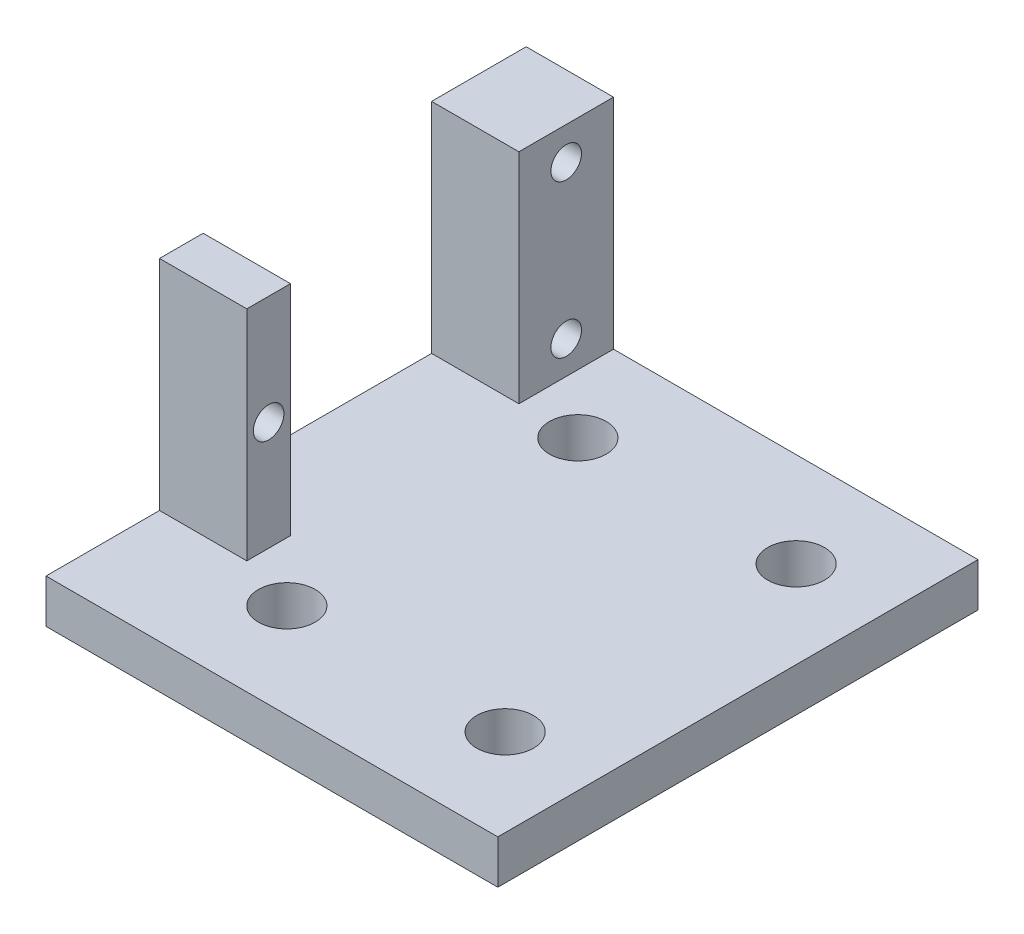
ISO-10303-21;
HEADER;
FILE_DESCRIPTION(('STEP AP214'),'2;1');
FILE_NAME('part.step','',(''),(''),'','','');
FILE_SCHEMA(('AUTOMOTIVE_DESIGN { 1 0 10303 214 1 1 1 1 }'));
ENDSEC;
DATA;
#1=APPLICATION_CONTEXT('core data for automotive mechanical design processes');
#2=APPLICATION_PROTOCOL_DEFINITION('international standard','automotive_design',2000,#1);
#3=PRODUCT_CONTEXT('',#1,'mechanical');
#4=PRODUCT('Part','Part','',(#3));
#5=PRODUCT_RELATED_PRODUCT_CATEGORY('part','',(#4));
#6=PRODUCT_DEFINITION_FORMATION('','',#4);
#7=PRODUCT_DEFINITION_CONTEXT('part definition',#1,'design');
#8=PRODUCT_DEFINITION('design','',#6,#7);
#9=PRODUCT_DEFINITION_SHAPE('','',#8);
#10=(LENGTH_UNIT() NAMED_UNIT(*) SI_UNIT(.MILLI.,.METRE.));
#11=(NAMED_UNIT(*) PLANE_ANGLE_UNIT() SI_UNIT($,.RADIAN.));
#12=(NAMED_UNIT(*) SI_UNIT($,.STERADIAN.) SOLID_ANGLE_UNIT());
#13=UNCERTAINTY_MEASURE_WITH_UNIT(LENGTH_MEASURE(1.E-05),#10,'distance_accuracy_value','');
#14=(GEOMETRIC_REPRESENTATION_CONTEXT(3) GLOBAL_UNCERTAINTY_ASSIGNED_CONTEXT((#13)) GLOBAL_UNIT_ASSIGNED_CONTEXT((#10,
#11,#12)) REPRESENTATION_CONTEXT('',''));
#15=CARTESIAN_POINT('',(0.,0.,0.));
#16=DIRECTION('',(0.,0.,1.));
#17=DIRECTION('',(1.,0.,0.));
#18=AXIS2_PLACEMENT_3D('',#15,#16,#17);
#19=CARTESIAN_POINT('',(0.,5.,0.));
#20=DIRECTION('',(0.,1.,0.));
#21=DIRECTION('',(0.,0.,1.));
#22=AXIS2_PLACEMENT_3D('',#19,#20,#21);
#23=PLANE('',#22);
#24=CARTESIAN_POINT('',(18.25,5.,16.665));
#25=DIRECTION('',(0.,1.,0.));
#26=DIRECTION('',(0.,0.,1.));
#27=AXIS2_PLACEMENT_3D('',#24,#25,#26);
#28=CIRCLE('',#27,3.25);
#29=CARTESIAN_POINT('',(18.25,5.,19.915));
#30=VERTEX_POINT('',#29);
#31=EDGE_CURVE('E200',#30,#30,#28,.T.);
#32=ORIENTED_EDGE('',*,*,#31,.F.);
#33=EDGE_LOOP('',(#32));
#34=FACE_BOUND('',#33,.T.);
#35=CARTESIAN_POINT('',(18.25,5.,-16.665));
#36=DIRECTION('',(0.,1.,0.));
#37=DIRECTION('',(0.,0.,1.));
#38=AXIS2_PLACEMENT_3D('',#35,#36,#37);
#39=CIRCLE('',#38,3.25);
#40=CARTESIAN_POINT('',(18.25,5.,-13.415));
#41=VERTEX_POINT('',#40);
#42=EDGE_CURVE('E204',#41,#41,#39,.T.);
#43=ORIENTED_EDGE('',*,*,#42,.F.);
#44=EDGE_LOOP('',(#43));
#45=FACE_BOUND('',#44,.T.);
#46=CARTESIAN_POINT('',(-6.75,5.,16.665));
#47=DIRECTION('',(0.,1.,0.));
#48=DIRECTION('',(0.,0.,1.));
#49=AXIS2_PLACEMENT_3D('',#46,#47,#48);
#50=CIRCLE('',#49,3.25);
#51=CARTESIAN_POINT('',(-6.75,5.,19.915));
#52=VERTEX_POINT('',#51);
#53=EDGE_CURVE('E209',#52,#52,#50,.T.);
#54=ORIENTED_EDGE('',*,*,#53,.F.);
#55=EDGE_LOOP('',(#54));
#56=FACE_BOUND('',#55,.T.);
#57=CARTESIAN_POINT('',(-6.75,5.,-16.665));
#58=DIRECTION('',(0.,1.,0.));
#59=DIRECTION('',(0.,0.,1.));
#60=AXIS2_PLACEMENT_3D('',#57,#58,#59);
#61=CIRCLE('',#60,3.25);
#62=CARTESIAN_POINT('',(-6.75,5.,-13.415));
#63=VERTEX_POINT('',#62);
#64=EDGE_CURVE('E213',#63,#63,#61,.T.);
#65=ORIENTED_EDGE('',*,*,#64,.F.);
#66=EDGE_LOOP('',(#65));
#67=FACE_BOUND('',#66,.T.);
#68=DIRECTION('',(0.,0.,-1.));
#69=VECTOR('',#68,1.);
#70=CARTESIAN_POINT('',(-13.5,5.,0.));
#71=LINE('',#70,#69);
#72=CARTESIAN_POINT('',(-13.5,5.,14.5));
#73=VERTEX_POINT('',#72);
#74=CARTESIAN_POINT('',(-13.5,5.,9.5));
#75=VERTEX_POINT('',#74);
#76=EDGE_CURVE('E60',#73,#75,#71,.T.);
#77=ORIENTED_EDGE('',*,*,#76,.F.);
#78=DIRECTION('',(-1.,0.,0.));
#79=VECTOR('',#78,1.);
#80=CARTESIAN_POINT('',(0.,5.,14.5));
#81=LINE('',#80,#79);
#82=CARTESIAN_POINT('',(-23.5,5.,14.5));
#83=VERTEX_POINT('',#82);
#84=EDGE_CURVE('E163',#73,#83,#81,.T.);
#85=ORIENTED_EDGE('',*,*,#84,.T.);
#86=DIRECTION('',(0.,0.,1.));
#87=VECTOR('',#86,1.);
#88=CARTESIAN_POINT('',(-23.5,5.,0.));
#89=LINE('',#88,#87);
#90=CARTESIAN_POINT('',(-23.5,5.,27.5));
#91=VERTEX_POINT('',#90);
#92=EDGE_CURVE('E151',#83,#91,#89,.T.);
#93=ORIENTED_EDGE('',*,*,#92,.T.);
#94=DIRECTION('',(1.,0.,0.));
#95=VECTOR('',#94,1.);
#96=CARTESIAN_POINT('',(0.,5.,27.5));
#97=LINE('',#96,#95);
#98=CARTESIAN_POINT('',(28.25,5.,27.5));
#99=VERTEX_POINT('',#98);
#100=EDGE_CURVE('E223',#91,#99,#97,.T.);
#101=ORIENTED_EDGE('',*,*,#100,.T.);
#102=DIRECTION('',(0.,0.,1.));
#103=VECTOR('',#102,1.);
#104=CARTESIAN_POINT('',(28.25,5.,0.));
#105=LINE('',#104,#103);
#106=CARTESIAN_POINT('',(28.25,5.,-27.5));
#107=VERTEX_POINT('',#106);
#108=EDGE_CURVE('E226',#107,#99,#105,.T.);
#109=ORIENTED_EDGE('',*,*,#108,.F.);
#110=DIRECTION('',(1.,0.,0.));
#111=VECTOR('',#110,1.);
#112=CARTESIAN_POINT('',(0.,5.,-27.5));
#113=LINE('',#112,#111);
#114=CARTESIAN_POINT('',(-13.5,5.,-27.5));
#115=VERTEX_POINT('',#114);
#116=EDGE_CURVE('E217',#115,#107,#113,.T.);
#117=ORIENTED_EDGE('',*,*,#116,.F.);
#118=DIRECTION('',(0.,0.,-1.));
#119=VECTOR('',#118,1.);
#120=CARTESIAN_POINT('',(-13.5,5.,0.));
#121=LINE('',#120,#119);
#122=CARTESIAN_POINT('',(-13.5,5.,-16.665));
#123=VERTEX_POINT('',#122);
#124=EDGE_CURVE('E191',#123,#115,#121,.T.);
#125=ORIENTED_EDGE('',*,*,#124,.F.);
#126=DIRECTION('',(-1.,0.,0.));
#127=VECTOR('',#126,1.);
#128=CARTESIAN_POINT('',(0.,5.,-16.665));
#129=LINE('',#128,#127);
#130=CARTESIAN_POINT('',(-23.5,5.,-16.665));
#131=VERTEX_POINT('',#130);
#132=EDGE_CURVE('E195',#123,#131,#129,.T.);
#133=ORIENTED_EDGE('',*,*,#132,.T.);
#134=CARTESIAN_POINT('',(-23.5,5.,9.5));
#135=VERTEX_POINT('',#134);
#136=EDGE_CURVE('E220',#131,#135,#89,.T.);
#137=ORIENTED_EDGE('',*,*,#136,.T.);
#138=DIRECTION('',(-1.,0.,0.));
#139=VECTOR('',#138,1.);
#140=CARTESIAN_POINT('',(0.,5.,9.5));
#141=LINE('',#140,#139);
#142=EDGE_CURVE('E65',#75,#135,#141,.T.);
#143=ORIENTED_EDGE('',*,*,#142,.F.);
#144=EDGE_LOOP('',(#77,#85,#93,#101,#109,#117,#125,#133,#137,#143));
#145=FACE_BOUND('',#144,.T.);
#146=ADVANCED_FACE('F42',(#34,#45,#56,#67,#145),#23,.T.);
#147=CARTESIAN_POINT('',(0.,5.,-27.5));
#148=DIRECTION('',(0.,0.,-1.));
#149=DIRECTION('',(-1.,0.,0.));
#150=AXIS2_PLACEMENT_3D('',#147,#148,#149);
#151=PLANE('',#150);
#152=DIRECTION('',(0.,-1.,0.));
#153=VECTOR('',#152,1.);
#154=CARTESIAN_POINT('',(28.25,5.,-27.5));
#155=LINE('',#154,#153);
#156=CARTESIAN_POINT('',(28.25,0.,-27.5));
#157=VERTEX_POINT('',#156);
#158=EDGE_CURVE('E230',#107,#157,#155,.T.);
#159=ORIENTED_EDGE('',*,*,#158,.T.);
#160=DIRECTION('',(1.,0.,0.));
#161=VECTOR('',#160,1.);
#162=CARTESIAN_POINT('',(0.,0.,-27.5));
#163=LINE('',#162,#161);
#164=CARTESIAN_POINT('',(-23.5,0.,-27.5));
#165=VERTEX_POINT('',#164);
#166=EDGE_CURVE('E246',#165,#157,#163,.T.);
#167=ORIENTED_EDGE('',*,*,#166,.F.);
#168=DIRECTION('',(0.,-1.,0.));
#169=VECTOR('',#168,1.);
#170=CARTESIAN_POINT('',(-23.5,5.,-27.5));
#171=LINE('',#170,#169);
#172=CARTESIAN_POINT('',(-23.5,30.,-27.5));
#173=VERTEX_POINT('',#172);
#174=EDGE_CURVE('E11',#173,#165,#171,.T.);
#175=ORIENTED_EDGE('',*,*,#174,.F.);
#176=DIRECTION('',(1.,0.,0.));
#177=VECTOR('',#176,1.);
#178=CARTESIAN_POINT('',(0.,30.,-27.5));
#179=LINE('',#178,#177);
#180=CARTESIAN_POINT('',(-13.5,30.,-27.5));
#181=VERTEX_POINT('',#180);
#182=EDGE_CURVE('E177',#173,#181,#179,.T.);
#183=ORIENTED_EDGE('',*,*,#182,.T.);
#184=DIRECTION('',(0.,-1.,0.));
#185=VECTOR('',#184,1.);
#186=CARTESIAN_POINT('',(-13.5,30.,-27.5));
#187=LINE('',#186,#185);
#188=EDGE_CURVE('E181',#181,#115,#187,.T.);
#189=ORIENTED_EDGE('',*,*,#188,.T.);
#190=ORIENTED_EDGE('',*,*,#116,.T.);
#191=EDGE_LOOP('',(#159,#167,#175,#183,#189,#190));
#192=FACE_BOUND('',#191,.T.);
#193=ADVANCED_FACE('F313',(#192),#151,.T.);
#194=CARTESIAN_POINT('',(-23.5,5.,0.));
#195=DIRECTION('',(1.,0.,0.));
#196=DIRECTION('',(0.,0.,-1.));
#197=AXIS2_PLACEMENT_3D('',#194,#195,#196);
#198=PLANE('',#197);
#199=CARTESIAN_POINT('',(-23.5,17.5,12.));
#200=DIRECTION('',(1.,0.,0.));
#201=DIRECTION('',(0.,0.,-1.));
#202=AXIS2_PLACEMENT_3D('',#199,#200,#201);
#203=CIRCLE('',#202,1.75);
#204=CARTESIAN_POINT('',(-23.5,17.5,10.25));
#205=VERTEX_POINT('',#204);
#206=EDGE_CURVE('E283',#205,#205,#203,.T.);
#207=ORIENTED_EDGE('',*,*,#206,.T.);
#208=EDGE_LOOP('',(#207));
#209=FACE_BOUND('',#208,.T.);
#210=CARTESIAN_POINT('',(-23.5,26.25,-22.0825));
#211=DIRECTION('',(1.,0.,0.));
#212=DIRECTION('',(0.,0.,-1.));
#213=AXIS2_PLACEMENT_3D('',#210,#211,#212);
#214=CIRCLE('',#213,1.75);
#215=CARTESIAN_POINT('',(-23.5,26.25,-23.8325));
#216=VERTEX_POINT('',#215);
#217=EDGE_CURVE('E270',#216,#216,#214,.T.);
#218=ORIENTED_EDGE('',*,*,#217,.T.);
#219=EDGE_LOOP('',(#218));
#220=FACE_BOUND('',#219,.T.);
#221=CARTESIAN_POINT('',(-23.5,8.75,-22.0825));
#222=DIRECTION('',(1.,0.,0.));
#223=DIRECTION('',(0.,0.,-1.));
#224=AXIS2_PLACEMENT_3D('',#221,#222,#223);
#225=CIRCLE('',#224,1.75);
#226=CARTESIAN_POINT('',(-23.5,8.75,-23.8325));
#227=VERTEX_POINT('',#226);
#228=EDGE_CURVE('E277',#227,#227,#225,.T.);
#229=ORIENTED_EDGE('',*,*,#228,.T.);
#230=EDGE_LOOP('',(#229));
#231=FACE_BOUND('',#230,.T.);
#232=DIRECTION('',(0.,0.,1.));
#233=VECTOR('',#232,1.);
#234=CARTESIAN_POINT('',(-23.5,0.,0.));
#235=LINE('',#234,#233);
#236=CARTESIAN_POINT('',(-23.5,0.,27.5));
#237=VERTEX_POINT('',#236);
#238=EDGE_CURVE('E249',#165,#237,#235,.T.);
#239=ORIENTED_EDGE('',*,*,#238,.T.);
#240=DIRECTION('',(0.,-1.,0.));
#241=VECTOR('',#240,1.);
#242=CARTESIAN_POINT('',(-23.5,5.,27.5));
#243=LINE('',#242,#241);
#244=EDGE_CURVE('E52',#91,#237,#243,.T.);
#245=ORIENTED_EDGE('',*,*,#244,.F.);
#246=ORIENTED_EDGE('',*,*,#92,.F.);
#247=DIRECTION('',(0.,-1.,0.));
#248=VECTOR('',#247,1.);
#249=CARTESIAN_POINT('',(-23.5,30.,14.5));
#250=LINE('',#249,#248);
#251=CARTESIAN_POINT('',(-23.5,30.,14.5));
#252=VERTEX_POINT('',#251);
#253=EDGE_CURVE('E129',#252,#83,#250,.T.);
#254=ORIENTED_EDGE('',*,*,#253,.F.);
#255=DIRECTION('',(0.,0.,1.));
#256=VECTOR('',#255,1.);
#257=CARTESIAN_POINT('',(-23.5,30.,0.));
#258=LINE('',#257,#256);
#259=CARTESIAN_POINT('',(-23.5,30.,9.5));
#260=VERTEX_POINT('',#259);
#261=EDGE_CURVE('E137',#260,#252,#258,.T.);
#262=ORIENTED_EDGE('',*,*,#261,.F.);
#263=DIRECTION('',(0.,-1.,0.));
#264=VECTOR('',#263,1.);
#265=CARTESIAN_POINT('',(-23.5,30.,9.5));
#266=LINE('',#265,#264);
#267=EDGE_CURVE('E293',#260,#135,#266,.T.);
#268=ORIENTED_EDGE('',*,*,#267,.T.);
#269=ORIENTED_EDGE('',*,*,#136,.F.);
#270=DIRECTION('',(0.,-1.,0.));
#271=VECTOR('',#270,1.);
#272=CARTESIAN_POINT('',(-23.5,30.,-16.665));
#273=LINE('',#272,#271);
#274=CARTESIAN_POINT('',(-23.5,30.,-16.665));
#275=VERTEX_POINT('',#274);
#276=EDGE_CURVE('E188',#275,#131,#273,.T.);
#277=ORIENTED_EDGE('',*,*,#276,.F.);
#278=DIRECTION('',(0.,0.,1.));
#279=VECTOR('',#278,1.);
#280=CARTESIAN_POINT('',(-23.5,30.,0.));
#281=LINE('',#280,#279);
#282=EDGE_CURVE('E166',#173,#275,#281,.T.);
#283=ORIENTED_EDGE('',*,*,#282,.F.);
#284=ORIENTED_EDGE('',*,*,#174,.T.);
#285=EDGE_LOOP('',(#239,#245,#246,#254,#262,#268,#269,#277,#283,#284));
#286=FACE_BOUND('',#285,.T.);
#287=ADVANCED_FACE('F149',(#209,#220,#231,#286),#198,.F.);
#288=CARTESIAN_POINT('',(0.,5.,27.5));
#289=DIRECTION('',(0.,0.,-1.));
#290=DIRECTION('',(-1.,0.,0.));
#291=AXIS2_PLACEMENT_3D('',#288,#289,#290);
#292=PLANE('',#291);
#293=DIRECTION('',(1.,0.,0.));
#294=VECTOR('',#293,1.);
#295=CARTESIAN_POINT('',(0.,0.,27.5));
#296=LINE('',#295,#294);
#297=CARTESIAN_POINT('',(28.25,0.,27.5));
#298=VERTEX_POINT('',#297);
#299=EDGE_CURVE('E252',#237,#298,#296,.T.);
#300=ORIENTED_EDGE('',*,*,#299,.T.);
#301=DIRECTION('',(0.,-1.,0.));
#302=VECTOR('',#301,1.);
#303=CARTESIAN_POINT('',(28.25,5.,27.5));
#304=LINE('',#303,#302);
#305=EDGE_CURVE('E262',#99,#298,#304,.T.);
#306=ORIENTED_EDGE('',*,*,#305,.F.);
#307=ORIENTED_EDGE('',*,*,#100,.F.);
#308=ORIENTED_EDGE('',*,*,#244,.T.);
#309=EDGE_LOOP('',(#300,#306,#307,#308));
#310=FACE_BOUND('',#309,.T.);
#311=ADVANCED_FACE('F335',(#310),#292,.F.);
#312=CARTESIAN_POINT('',(-6.75,5.,-16.665));
#313=DIRECTION('',(0.,-1.,0.));
#314=DIRECTION('',(0.,0.,-1.));
#315=AXIS2_PLACEMENT_3D('',#312,#313,#314);
#316=CYLINDRICAL_SURFACE('',#315,3.25);
#317=ORIENTED_EDGE('',*,*,#64,.T.);
#318=EDGE_LOOP('',(#317));
#319=FACE_BOUND('',#318,.T.);
#320=CARTESIAN_POINT('',(-6.75,0.,-16.665));
#321=DIRECTION('',(0.,1.,0.));
#322=DIRECTION('',(0.,0.,1.));
#323=AXIS2_PLACEMENT_3D('',#320,#321,#322);
#324=CIRCLE('',#323,3.25);
#325=CARTESIAN_POINT('',(-6.75,0.,-13.415));
#326=VERTEX_POINT('',#325);
#327=EDGE_CURVE('E242',#326,#326,#324,.T.);
#328=ORIENTED_EDGE('',*,*,#327,.F.);
#329=EDGE_LOOP('',(#328));
#330=FACE_BOUND('',#329,.T.);
#331=ADVANCED_FACE('F338',(#319,#330),#316,.F.);
#332=CARTESIAN_POINT('',(-6.75,5.,16.665));
#333=DIRECTION('',(0.,-1.,0.));
#334=DIRECTION('',(0.,0.,-1.));
#335=AXIS2_PLACEMENT_3D('',#332,#333,#334);
#336=CYLINDRICAL_SURFACE('',#335,3.25);
#337=ORIENTED_EDGE('',*,*,#53,.T.);
#338=EDGE_LOOP('',(#337));
#339=FACE_BOUND('',#338,.T.);
#340=CARTESIAN_POINT('',(-6.75,0.,16.665));
#341=DIRECTION('',(0.,1.,0.));
#342=DIRECTION('',(0.,0.,1.));
#343=AXIS2_PLACEMENT_3D('',#340,#341,#342);
#344=CIRCLE('',#343,3.25);
#345=CARTESIAN_POINT('',(-6.75,0.,19.915));
#346=VERTEX_POINT('',#345);
#347=EDGE_CURVE('E238',#346,#346,#344,.T.);
#348=ORIENTED_EDGE('',*,*,#347,.F.);
#349=EDGE_LOOP('',(#348));
#350=FACE_BOUND('',#349,.T.);
#351=ADVANCED_FACE('F345',(#339,#350),#336,.F.);
#352=CARTESIAN_POINT('',(18.25,5.,-16.665));
#353=DIRECTION('',(0.,-1.,0.));
#354=DIRECTION('',(0.,0.,-1.));
#355=AXIS2_PLACEMENT_3D('',#352,#353,#354);
#356=CYLINDRICAL_SURFACE('',#355,3.25);
#357=ORIENTED_EDGE('',*,*,#42,.T.);
#358=EDGE_LOOP('',(#357));
#359=FACE_BOUND('',#358,.T.);
#360=CARTESIAN_POINT('',(18.25,0.,-16.665));
#361=DIRECTION('',(0.,1.,0.));
#362=DIRECTION('',(0.,0.,1.));
#363=AXIS2_PLACEMENT_3D('',#360,#361,#362);
#364=CIRCLE('',#363,3.25);
#365=CARTESIAN_POINT('',(18.25,0.,-13.415));
#366=VERTEX_POINT('',#365);
#367=EDGE_CURVE('E234',#366,#366,#364,.T.);
#368=ORIENTED_EDGE('',*,*,#367,.F.);
#369=EDGE_LOOP('',(#368));
#370=FACE_BOUND('',#369,.T.);
#371=ADVANCED_FACE('F348',(#359,#370),#356,.F.);
#372=CARTESIAN_POINT('',(18.25,5.,16.665));
#373=DIRECTION('',(0.,-1.,0.));
#374=DIRECTION('',(0.,0.,-1.));
#375=AXIS2_PLACEMENT_3D('',#372,#373,#374);
#376=CYLINDRICAL_SURFACE('',#375,3.25);
#377=ORIENTED_EDGE('',*,*,#31,.T.);
#378=EDGE_LOOP('',(#377));
#379=FACE_BOUND('',#378,.T.);
#380=CARTESIAN_POINT('',(18.25,0.,16.665));
#381=DIRECTION('',(0.,1.,0.));
#382=DIRECTION('',(0.,0.,1.));
#383=AXIS2_PLACEMENT_3D('',#380,#381,#382);
#384=CIRCLE('',#383,3.25);
#385=CARTESIAN_POINT('',(18.25,0.,19.915));
#386=VERTEX_POINT('',#385);
#387=EDGE_CURVE('E199',#386,#386,#384,.T.);
#388=ORIENTED_EDGE('',*,*,#387,.F.);
#389=EDGE_LOOP('',(#388));
#390=FACE_BOUND('',#389,.T.);
#391=ADVANCED_FACE('F44',(#379,#390),#376,.F.);
#392=CARTESIAN_POINT('',(28.25,5.,0.));
#393=DIRECTION('',(1.,0.,0.));
#394=DIRECTION('',(0.,0.,-1.));
#395=AXIS2_PLACEMENT_3D('',#392,#393,#394);
#396=PLANE('',#395);
#397=DIRECTION('',(0.,0.,1.));
#398=VECTOR('',#397,1.);
#399=CARTESIAN_POINT('',(28.25,0.,0.));
#400=LINE('',#399,#398);
#401=EDGE_CURVE('E205',#157,#298,#400,.T.);
#402=ORIENTED_EDGE('',*,*,#401,.F.);
#403=ORIENTED_EDGE('',*,*,#158,.F.);
#404=ORIENTED_EDGE('',*,*,#108,.T.);
#405=ORIENTED_EDGE('',*,*,#305,.T.);
#406=EDGE_LOOP('',(#402,#403,#404,#405));
#407=FACE_BOUND('',#406,.T.);
#408=ADVANCED_FACE('F330',(#407),#396,.T.);
#409=CARTESIAN_POINT('',(0.,0.,0.));
#410=DIRECTION('',(0.,1.,0.));
#411=DIRECTION('',(0.,0.,1.));
#412=AXIS2_PLACEMENT_3D('',#409,#410,#411);
#413=PLANE('',#412);
#414=ORIENTED_EDGE('',*,*,#299,.F.);
#415=ORIENTED_EDGE('',*,*,#238,.F.);
#416=ORIENTED_EDGE('',*,*,#166,.T.);
#417=ORIENTED_EDGE('',*,*,#401,.T.);
#418=EDGE_LOOP('',(#414,#415,#416,#417));
#419=FACE_BOUND('',#418,.T.);
#420=ORIENTED_EDGE('',*,*,#387,.T.);
#421=EDGE_LOOP('',(#420));
#422=FACE_BOUND('',#421,.T.);
#423=ORIENTED_EDGE('',*,*,#367,.T.);
#424=EDGE_LOOP('',(#423));
#425=FACE_BOUND('',#424,.T.);
#426=ORIENTED_EDGE('',*,*,#347,.T.);
#427=EDGE_LOOP('',(#426));
#428=FACE_BOUND('',#427,.T.);
#429=ORIENTED_EDGE('',*,*,#327,.T.);
#430=EDGE_LOOP('',(#429));
#431=FACE_BOUND('',#430,.T.);
#432=ADVANCED_FACE('F327',(#419,#422,#425,#428,#431),#413,.F.);
#433=CARTESIAN_POINT('',(0.,30.,-16.665));
#434=DIRECTION('',(0.,0.,-1.));
#435=DIRECTION('',(-1.,0.,0.));
#436=AXIS2_PLACEMENT_3D('',#433,#434,#435);
#437=PLANE('',#436);
#438=ORIENTED_EDGE('',*,*,#132,.F.);
#439=DIRECTION('',(0.,-1.,0.));
#440=VECTOR('',#439,1.);
#441=CARTESIAN_POINT('',(-13.5,30.,-16.665));
#442=LINE('',#441,#440);
#443=CARTESIAN_POINT('',(-13.5,30.,-16.665));
#444=VERTEX_POINT('',#443);
#445=EDGE_CURVE('E184',#444,#123,#442,.T.);
#446=ORIENTED_EDGE('',*,*,#445,.F.);
#447=DIRECTION('',(1.,0.,0.));
#448=VECTOR('',#447,1.);
#449=CARTESIAN_POINT('',(0.,30.,-16.665));
#450=LINE('',#449,#448);
#451=EDGE_CURVE('E170',#275,#444,#450,.T.);
#452=ORIENTED_EDGE('',*,*,#451,.F.);
#453=ORIENTED_EDGE('',*,*,#276,.T.);
#454=EDGE_LOOP('',(#438,#446,#452,#453));
#455=FACE_BOUND('',#454,.T.);
#456=ADVANCED_FACE('F325',(#455),#437,.F.);
#457=CARTESIAN_POINT('',(-13.5,30.,0.));
#458=DIRECTION('',(1.,0.,0.));
#459=DIRECTION('',(0.,0.,-1.));
#460=AXIS2_PLACEMENT_3D('',#457,#458,#459);
#461=PLANE('',#460);
#462=CARTESIAN_POINT('',(-13.5,26.25,-22.0825));
#463=DIRECTION('',(1.,0.,0.));
#464=DIRECTION('',(0.,0.,-1.));
#465=AXIS2_PLACEMENT_3D('',#462,#463,#464);
#466=CIRCLE('',#465,1.75);
#467=CARTESIAN_POINT('',(-13.5,26.25,-23.8325));
#468=VERTEX_POINT('',#467);
#469=EDGE_CURVE('E46',#468,#468,#466,.T.);
#470=ORIENTED_EDGE('',*,*,#469,.F.);
#471=EDGE_LOOP('',(#470));
#472=FACE_BOUND('',#471,.T.);
#473=CARTESIAN_POINT('',(-13.5,8.75,-22.0825));
#474=DIRECTION('',(1.,0.,0.));
#475=DIRECTION('',(0.,0.,-1.));
#476=AXIS2_PLACEMENT_3D('',#473,#474,#475);
#477=CIRCLE('',#476,1.75);
#478=CARTESIAN_POINT('',(-13.5,8.75,-23.8325));
#479=VERTEX_POINT('',#478);
#480=EDGE_CURVE('E267',#479,#479,#477,.T.);
#481=ORIENTED_EDGE('',*,*,#480,.F.);
#482=EDGE_LOOP('',(#481));
#483=FACE_BOUND('',#482,.T.);
#484=ORIENTED_EDGE('',*,*,#445,.T.);
#485=ORIENTED_EDGE('',*,*,#124,.T.);
#486=ORIENTED_EDGE('',*,*,#188,.F.);
#487=DIRECTION('',(0.,0.,1.));
#488=VECTOR('',#487,1.);
#489=CARTESIAN_POINT('',(-13.5,30.,0.));
#490=LINE('',#489,#488);
#491=EDGE_CURVE('E173',#181,#444,#490,.T.);
#492=ORIENTED_EDGE('',*,*,#491,.T.);
#493=EDGE_LOOP('',(#484,#485,#486,#492));
#494=FACE_BOUND('',#493,.T.);
#495=ADVANCED_FACE('F390',(#472,#483,#494),#461,.T.);
#496=CARTESIAN_POINT('',(0.,30.,0.));
#497=DIRECTION('',(0.,1.,0.));
#498=DIRECTION('',(0.,0.,1.));
#499=AXIS2_PLACEMENT_3D('',#496,#497,#498);
#500=PLANE('',#499);
#501=ORIENTED_EDGE('',*,*,#282,.T.);
#502=ORIENTED_EDGE('',*,*,#451,.T.);
#503=ORIENTED_EDGE('',*,*,#491,.F.);
#504=ORIENTED_EDGE('',*,*,#182,.F.);
#505=EDGE_LOOP('',(#501,#502,#503,#504));
#506=FACE_BOUND('',#505,.T.);
#507=ADVANCED_FACE('F309',(#506),#500,.T.);
#508=CARTESIAN_POINT('',(0.,30.,14.5));
#509=DIRECTION('',(0.,0.,-1.));
#510=DIRECTION('',(-1.,0.,0.));
#511=AXIS2_PLACEMENT_3D('',#508,#509,#510);
#512=PLANE('',#511);
#513=ORIENTED_EDGE('',*,*,#84,.F.);
#514=DIRECTION('',(0.,-1.,0.));
#515=VECTOR('',#514,1.);
#516=CARTESIAN_POINT('',(-13.5,30.,14.5));
#517=LINE('',#516,#515);
#518=CARTESIAN_POINT('',(-13.5,30.,14.5));
#519=VERTEX_POINT('',#518);
#520=EDGE_CURVE('E131',#519,#73,#517,.T.);
#521=ORIENTED_EDGE('',*,*,#520,.F.);
#522=DIRECTION('',(1.,0.,0.));
#523=VECTOR('',#522,1.);
#524=CARTESIAN_POINT('',(0.,30.,14.5));
#525=LINE('',#524,#523);
#526=EDGE_CURVE('E125',#252,#519,#525,.T.);
#527=ORIENTED_EDGE('',*,*,#526,.F.);
#528=ORIENTED_EDGE('',*,*,#253,.T.);
#529=EDGE_LOOP('',(#513,#521,#527,#528));
#530=FACE_BOUND('',#529,.T.);
#531=ADVANCED_FACE('F127',(#530),#512,.F.);
#532=CARTESIAN_POINT('',(-13.5,30.,0.));
#533=DIRECTION('',(1.,0.,0.));
#534=DIRECTION('',(0.,0.,-1.));
#535=AXIS2_PLACEMENT_3D('',#532,#533,#534);
#536=PLANE('',#535);
#537=CARTESIAN_POINT('',(-13.5,17.5,12.));
#538=DIRECTION('',(1.,0.,0.));
#539=DIRECTION('',(0.,0.,-1.));
#540=AXIS2_PLACEMENT_3D('',#537,#538,#539);
#541=CIRCLE('',#540,1.75);
#542=CARTESIAN_POINT('',(-13.5,17.5,10.25));
#543=VERTEX_POINT('',#542);
#544=EDGE_CURVE('E286',#543,#543,#541,.T.);
#545=ORIENTED_EDGE('',*,*,#544,.F.);
#546=EDGE_LOOP('',(#545));
#547=FACE_BOUND('',#546,.T.);
#548=ORIENTED_EDGE('',*,*,#520,.T.);
#549=ORIENTED_EDGE('',*,*,#76,.T.);
#550=DIRECTION('',(0.,-1.,0.));
#551=VECTOR('',#550,1.);
#552=CARTESIAN_POINT('',(-13.5,30.,9.5));
#553=LINE('',#552,#551);
#554=CARTESIAN_POINT('',(-13.5,30.,9.5));
#555=VERTEX_POINT('',#554);
#556=EDGE_CURVE('E157',#555,#75,#553,.T.);
#557=ORIENTED_EDGE('',*,*,#556,.F.);
#558=DIRECTION('',(0.,0.,1.));
#559=VECTOR('',#558,1.);
#560=CARTESIAN_POINT('',(-13.5,30.,0.));
#561=LINE('',#560,#559);
#562=EDGE_CURVE('E136',#555,#519,#561,.T.);
#563=ORIENTED_EDGE('',*,*,#562,.T.);
#564=EDGE_LOOP('',(#548,#549,#557,#563));
#565=FACE_BOUND('',#564,.T.);
#566=ADVANCED_FACE('F300',(#547,#565),#536,.T.);
#567=CARTESIAN_POINT('',(0.,30.,9.5));
#568=DIRECTION('',(0.,0.,-1.));
#569=DIRECTION('',(-1.,0.,0.));
#570=AXIS2_PLACEMENT_3D('',#567,#568,#569);
#571=PLANE('',#570);
#572=ORIENTED_EDGE('',*,*,#556,.T.);
#573=ORIENTED_EDGE('',*,*,#142,.T.);
#574=ORIENTED_EDGE('',*,*,#267,.F.);
#575=DIRECTION('',(1.,0.,0.));
#576=VECTOR('',#575,1.);
#577=CARTESIAN_POINT('',(0.,30.,9.5));
#578=LINE('',#577,#576);
#579=EDGE_CURVE('E143',#260,#555,#578,.T.);
#580=ORIENTED_EDGE('',*,*,#579,.T.);
#581=EDGE_LOOP('',(#572,#573,#574,#580));
#582=FACE_BOUND('',#581,.T.);
#583=ADVANCED_FACE('F298',(#582),#571,.T.);
#584=CARTESIAN_POINT('',(0.,30.,0.));
#585=DIRECTION('',(0.,1.,0.));
#586=DIRECTION('',(0.,0.,1.));
#587=AXIS2_PLACEMENT_3D('',#584,#585,#586);
#588=PLANE('',#587);
#589=ORIENTED_EDGE('',*,*,#261,.T.);
#590=ORIENTED_EDGE('',*,*,#526,.T.);
#591=ORIENTED_EDGE('',*,*,#562,.F.);
#592=ORIENTED_EDGE('',*,*,#579,.F.);
#593=EDGE_LOOP('',(#589,#590,#591,#592));
#594=FACE_BOUND('',#593,.T.);
#595=ADVANCED_FACE('F141',(#594),#588,.T.);
#596=CARTESIAN_POINT('',(-23.5,8.75,-22.0825));
#597=DIRECTION('',(1.,0.,0.));
#598=DIRECTION('',(0.,0.,-1.));
#599=AXIS2_PLACEMENT_3D('',#596,#597,#598);
#600=CYLINDRICAL_SURFACE('',#599,1.75);
#601=ORIENTED_EDGE('',*,*,#480,.T.);
#602=EDGE_LOOP('',(#601));
#603=FACE_BOUND('',#602,.T.);
#604=ORIENTED_EDGE('',*,*,#228,.F.);
#605=EDGE_LOOP('',(#604));
#606=FACE_BOUND('',#605,.T.);
#607=ADVANCED_FACE('F426',(#603,#606),#600,.F.);
#608=CARTESIAN_POINT('',(-23.5,26.25,-22.0825));
#609=DIRECTION('',(1.,0.,0.));
#610=DIRECTION('',(0.,0.,-1.));
#611=AXIS2_PLACEMENT_3D('',#608,#609,#610);
#612=CYLINDRICAL_SURFACE('',#611,1.75);
#613=ORIENTED_EDGE('',*,*,#469,.T.);
#614=EDGE_LOOP('',(#613));
#615=FACE_BOUND('',#614,.T.);
#616=ORIENTED_EDGE('',*,*,#217,.F.);
#617=EDGE_LOOP('',(#616));
#618=FACE_BOUND('',#617,.T.);
#619=ADVANCED_FACE('F436',(#615,#618),#612,.F.);
#620=CARTESIAN_POINT('',(-23.5,17.5,12.));
#621=DIRECTION('',(1.,0.,0.));
#622=DIRECTION('',(0.,0.,-1.));
#623=AXIS2_PLACEMENT_3D('',#620,#621,#622);
#624=CYLINDRICAL_SURFACE('',#623,1.75);
#625=ORIENTED_EDGE('',*,*,#206,.F.);
#626=EDGE_LOOP('',(#625));
#627=FACE_BOUND('',#626,.T.);
#628=ORIENTED_EDGE('',*,*,#544,.T.);
#629=EDGE_LOOP('',(#628));
#630=FACE_BOUND('',#629,.T.);
#631=ADVANCED_FACE('F442',(#627,#630),#624,.F.);
#632=CLOSED_SHELL('',(#146,#193,#287,#311,#331,#351,#371,#391,#408,#432,#456,#495,#507,#531,
#566,#583,#595,#607,#619,#631));
#633=MANIFOLD_SOLID_BREP('B2',#632);
#634=ADVANCED_BREP_SHAPE_REPRESENTATION('',(#18,#633),#14);
#635=SHAPE_DEFINITION_REPRESENTATION(#9,#634);
ENDSEC;
END-ISO-10303-21;
